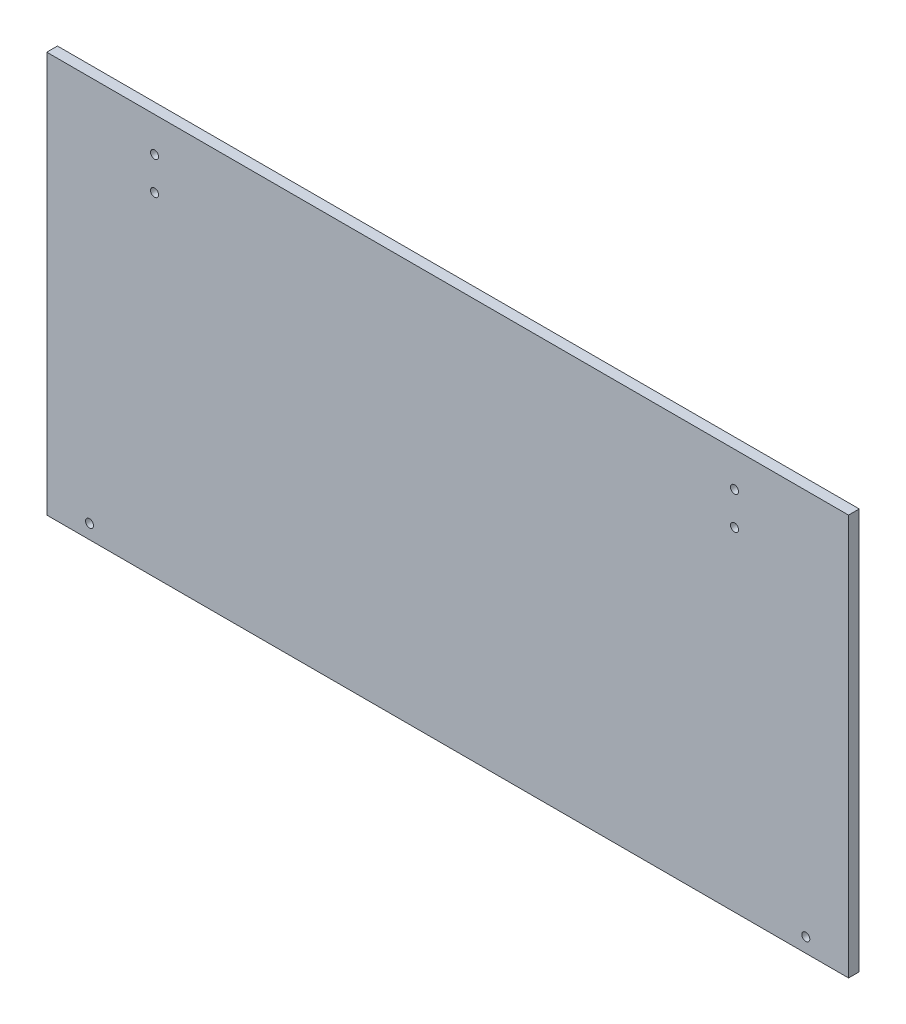
ISO-10303-21;
HEADER;
FILE_DESCRIPTION(('STEP AP214'),'2;1');
FILE_NAME('part.step','',(''),(''),'','','');
FILE_SCHEMA(('AUTOMOTIVE_DESIGN { 1 0 10303 214 1 1 1 1 }'));
ENDSEC;
DATA;
#1=APPLICATION_CONTEXT('core data for automotive mechanical design processes');
#2=APPLICATION_PROTOCOL_DEFINITION('international standard','automotive_design',2000,#1);
#3=PRODUCT_CONTEXT('',#1,'mechanical');
#4=PRODUCT('Part','Part','',(#3));
#5=PRODUCT_RELATED_PRODUCT_CATEGORY('part','',(#4));
#6=PRODUCT_DEFINITION_FORMATION('','',#4);
#7=PRODUCT_DEFINITION_CONTEXT('part definition',#1,'design');
#8=PRODUCT_DEFINITION('design','',#6,#7);
#9=PRODUCT_DEFINITION_SHAPE('','',#8);
#10=(LENGTH_UNIT() NAMED_UNIT(*) SI_UNIT(.MILLI.,.METRE.));
#11=(NAMED_UNIT(*) PLANE_ANGLE_UNIT() SI_UNIT($,.RADIAN.));
#12=(NAMED_UNIT(*) SI_UNIT($,.STERADIAN.) SOLID_ANGLE_UNIT());
#13=UNCERTAINTY_MEASURE_WITH_UNIT(LENGTH_MEASURE(1.E-05),#10,'distance_accuracy_value','');
#14=(GEOMETRIC_REPRESENTATION_CONTEXT(3) GLOBAL_UNCERTAINTY_ASSIGNED_CONTEXT((#13)) GLOBAL_UNIT_ASSIGNED_CONTEXT((#10,
#11,#12)) REPRESENTATION_CONTEXT('',''));
#15=CARTESIAN_POINT('',(0.,0.,0.));
#16=DIRECTION('',(0.,0.,1.));
#17=DIRECTION('',(1.,0.,0.));
#18=AXIS2_PLACEMENT_3D('',#15,#16,#17);
#19=CARTESIAN_POINT('',(-225.,112.5,6.));
#20=DIRECTION('',(1.,0.,0.));
#21=DIRECTION('',(0.,1.,0.));
#22=AXIS2_PLACEMENT_3D('',#19,#20,#21);
#23=PLANE('',#22);
#24=DIRECTION('',(0.,-1.,0.));
#25=VECTOR('',#24,1.);
#26=CARTESIAN_POINT('',(-225.,112.5,0.));
#27=LINE('',#26,#25);
#28=CARTESIAN_POINT('',(-225.,112.5,0.));
#29=VERTEX_POINT('',#28);
#30=CARTESIAN_POINT('',(-225.,-112.5,0.));
#31=VERTEX_POINT('',#30);
#32=EDGE_CURVE('E103',#29,#31,#27,.T.);
#33=ORIENTED_EDGE('',*,*,#32,.T.);
#34=DIRECTION('',(0.,0.,-1.));
#35=VECTOR('',#34,1.);
#36=CARTESIAN_POINT('',(-225.,-112.5,6.));
#37=LINE('',#36,#35);
#38=CARTESIAN_POINT('',(-225.,-112.5,6.));
#39=VERTEX_POINT('',#38);
#40=EDGE_CURVE('E11',#39,#31,#37,.T.);
#41=ORIENTED_EDGE('',*,*,#40,.F.);
#42=DIRECTION('',(0.,-1.,0.));
#43=VECTOR('',#42,1.);
#44=CARTESIAN_POINT('',(-225.,112.5,6.));
#45=LINE('',#44,#43);
#46=CARTESIAN_POINT('',(-225.,112.5,6.));
#47=VERTEX_POINT('',#46);
#48=EDGE_CURVE('E90',#47,#39,#45,.T.);
#49=ORIENTED_EDGE('',*,*,#48,.F.);
#50=DIRECTION('',(0.,0.,-1.));
#51=VECTOR('',#50,1.);
#52=CARTESIAN_POINT('',(-225.,112.5,6.));
#53=LINE('',#52,#51);
#54=EDGE_CURVE('E99',#47,#29,#53,.T.);
#55=ORIENTED_EDGE('',*,*,#54,.T.);
#56=EDGE_LOOP('',(#33,#41,#49,#55));
#57=FACE_BOUND('',#56,.T.);
#58=ADVANCED_FACE('F37',(#57),#23,.F.);
#59=CARTESIAN_POINT('',(-225.,-112.5,6.));
#60=DIRECTION('',(0.,1.,0.));
#61=DIRECTION('',(0.,0.,1.));
#62=AXIS2_PLACEMENT_3D('',#59,#60,#61);
#63=PLANE('',#62);
#64=DIRECTION('',(1.,0.,0.));
#65=VECTOR('',#64,1.);
#66=CARTESIAN_POINT('',(-225.,-112.5,0.));
#67=LINE('',#66,#65);
#68=CARTESIAN_POINT('',(225.,-112.5,0.));
#69=VERTEX_POINT('',#68);
#70=EDGE_CURVE('E94',#31,#69,#67,.T.);
#71=ORIENTED_EDGE('',*,*,#70,.T.);
#72=DIRECTION('',(0.,0.,-1.));
#73=VECTOR('',#72,1.);
#74=CARTESIAN_POINT('',(225.,-112.5,6.));
#75=LINE('',#74,#73);
#76=CARTESIAN_POINT('',(225.,-112.5,6.));
#77=VERTEX_POINT('',#76);
#78=EDGE_CURVE('E46',#77,#69,#75,.T.);
#79=ORIENTED_EDGE('',*,*,#78,.F.);
#80=DIRECTION('',(1.,0.,0.));
#81=VECTOR('',#80,1.);
#82=CARTESIAN_POINT('',(-225.,-112.5,6.));
#83=LINE('',#82,#81);
#84=EDGE_CURVE('E85',#39,#77,#83,.T.);
#85=ORIENTED_EDGE('',*,*,#84,.F.);
#86=ORIENTED_EDGE('',*,*,#40,.T.);
#87=EDGE_LOOP('',(#71,#79,#85,#86));
#88=FACE_BOUND('',#87,.T.);
#89=ADVANCED_FACE('F93',(#88),#63,.F.);
#90=CARTESIAN_POINT('',(225.,112.5,6.));
#91=DIRECTION('',(-1.,0.,0.));
#92=DIRECTION('',(0.,-1.,0.));
#93=AXIS2_PLACEMENT_3D('',#90,#91,#92);
#94=PLANE('',#93);
#95=DIRECTION('',(0.,1.,0.));
#96=VECTOR('',#95,1.);
#97=CARTESIAN_POINT('',(225.,112.5,0.));
#98=LINE('',#97,#96);
#99=CARTESIAN_POINT('',(225.,112.5,0.));
#100=VERTEX_POINT('',#99);
#101=EDGE_CURVE('E72',#69,#100,#98,.T.);
#102=ORIENTED_EDGE('',*,*,#101,.T.);
#103=DIRECTION('',(0.,0.,-1.));
#104=VECTOR('',#103,1.);
#105=CARTESIAN_POINT('',(225.,112.5,6.));
#106=LINE('',#105,#104);
#107=CARTESIAN_POINT('',(225.,112.5,6.));
#108=VERTEX_POINT('',#107);
#109=EDGE_CURVE('E95',#108,#100,#106,.T.);
#110=ORIENTED_EDGE('',*,*,#109,.F.);
#111=DIRECTION('',(0.,1.,0.));
#112=VECTOR('',#111,1.);
#113=CARTESIAN_POINT('',(225.,112.5,6.));
#114=LINE('',#113,#112);
#115=EDGE_CURVE('E88',#77,#108,#114,.T.);
#116=ORIENTED_EDGE('',*,*,#115,.F.);
#117=ORIENTED_EDGE('',*,*,#78,.T.);
#118=EDGE_LOOP('',(#102,#110,#116,#117));
#119=FACE_BOUND('',#118,.T.);
#120=ADVANCED_FACE('F97',(#119),#94,.F.);
#121=CARTESIAN_POINT('',(-225.,112.5,6.));
#122=DIRECTION('',(0.,-1.,0.));
#123=DIRECTION('',(0.,0.,-1.));
#124=AXIS2_PLACEMENT_3D('',#121,#122,#123);
#125=PLANE('',#124);
#126=DIRECTION('',(-1.,0.,0.));
#127=VECTOR('',#126,1.);
#128=CARTESIAN_POINT('',(-225.,112.5,0.));
#129=LINE('',#128,#127);
#130=EDGE_CURVE('E78',#100,#29,#129,.T.);
#131=ORIENTED_EDGE('',*,*,#130,.T.);
#132=ORIENTED_EDGE('',*,*,#54,.F.);
#133=DIRECTION('',(-1.,0.,0.));
#134=VECTOR('',#133,1.);
#135=CARTESIAN_POINT('',(-225.,112.5,6.));
#136=LINE('',#135,#134);
#137=EDGE_CURVE('E55',#108,#47,#136,.T.);
#138=ORIENTED_EDGE('',*,*,#137,.F.);
#139=ORIENTED_EDGE('',*,*,#109,.T.);
#140=EDGE_LOOP('',(#131,#132,#138,#139));
#141=FACE_BOUND('',#140,.T.);
#142=ADVANCED_FACE('F154',(#141),#125,.F.);
#143=CARTESIAN_POINT('',(0.,0.,6.));
#144=DIRECTION('',(0.,0.,1.));
#145=DIRECTION('',(1.,0.,0.));
#146=AXIS2_PLACEMENT_3D('',#143,#144,#145);
#147=PLANE('',#146);
#148=CARTESIAN_POINT('',(-201.,-104.5,6.));
#149=DIRECTION('',(0.,0.,1.));
#150=DIRECTION('',(1.,0.,0.));
#151=AXIS2_PLACEMENT_3D('',#148,#149,#150);
#152=CIRCLE('',#151,2.25000000000001);
#153=CARTESIAN_POINT('',(-198.75,-104.5,6.));
#154=VERTEX_POINT('',#153);
#155=EDGE_CURVE('E125',#154,#154,#152,.T.);
#156=ORIENTED_EDGE('',*,*,#155,.F.);
#157=EDGE_LOOP('',(#156));
#158=FACE_BOUND('',#157,.T.);
#159=CARTESIAN_POINT('',(201.,-104.5,6.));
#160=DIRECTION('',(0.,0.,1.));
#161=DIRECTION('',(1.,0.,0.));
#162=AXIS2_PLACEMENT_3D('',#159,#160,#161);
#163=CIRCLE('',#162,2.25000000000001);
#164=CARTESIAN_POINT('',(203.25,-104.5,6.));
#165=VERTEX_POINT('',#164);
#166=EDGE_CURVE('E131',#165,#165,#163,.T.);
#167=ORIENTED_EDGE('',*,*,#166,.F.);
#168=EDGE_LOOP('',(#167));
#169=FACE_BOUND('',#168,.T.);
#170=CARTESIAN_POINT('',(-164.5,74.4999999999998,6.));
#171=DIRECTION('',(0.,0.,1.));
#172=DIRECTION('',(1.,0.,0.));
#173=AXIS2_PLACEMENT_3D('',#170,#171,#172);
#174=CIRCLE('',#173,2.25000000000001);
#175=CARTESIAN_POINT('',(-162.25,74.4999999999998,6.));
#176=VERTEX_POINT('',#175);
#177=EDGE_CURVE('E141',#176,#176,#174,.T.);
#178=ORIENTED_EDGE('',*,*,#177,.F.);
#179=EDGE_LOOP('',(#178));
#180=FACE_BOUND('',#179,.T.);
#181=CARTESIAN_POINT('',(161.,92.9999999999999,6.));
#182=DIRECTION('',(0.,0.,1.));
#183=DIRECTION('',(1.,0.,0.));
#184=AXIS2_PLACEMENT_3D('',#181,#182,#183);
#185=CIRCLE('',#184,2.25000000000001);
#186=CARTESIAN_POINT('',(163.25,92.9999999999999,6.));
#187=VERTEX_POINT('',#186);
#188=EDGE_CURVE('E140',#187,#187,#185,.T.);
#189=ORIENTED_EDGE('',*,*,#188,.F.);
#190=EDGE_LOOP('',(#189));
#191=FACE_BOUND('',#190,.T.);
#192=CARTESIAN_POINT('',(161.,74.4999999999999,6.));
#193=DIRECTION('',(0.,0.,1.));
#194=DIRECTION('',(1.,0.,0.));
#195=AXIS2_PLACEMENT_3D('',#192,#193,#194);
#196=CIRCLE('',#195,2.25000000000001);
#197=CARTESIAN_POINT('',(163.25,74.4999999999999,6.));
#198=VERTEX_POINT('',#197);
#199=EDGE_CURVE('E129',#198,#198,#196,.T.);
#200=ORIENTED_EDGE('',*,*,#199,.F.);
#201=EDGE_LOOP('',(#200));
#202=FACE_BOUND('',#201,.T.);
#203=CARTESIAN_POINT('',(-164.5,92.9999999999998,6.));
#204=DIRECTION('',(0.,0.,1.));
#205=DIRECTION('',(1.,0.,0.));
#206=AXIS2_PLACEMENT_3D('',#203,#204,#205);
#207=CIRCLE('',#206,2.25000000000001);
#208=CARTESIAN_POINT('',(-162.25,92.9999999999998,6.));
#209=VERTEX_POINT('',#208);
#210=EDGE_CURVE('E116',#209,#209,#207,.T.);
#211=ORIENTED_EDGE('',*,*,#210,.F.);
#212=EDGE_LOOP('',(#211));
#213=FACE_BOUND('',#212,.T.);
#214=ORIENTED_EDGE('',*,*,#48,.T.);
#215=ORIENTED_EDGE('',*,*,#84,.T.);
#216=ORIENTED_EDGE('',*,*,#115,.T.);
#217=ORIENTED_EDGE('',*,*,#137,.T.);
#218=EDGE_LOOP('',(#214,#215,#216,#217));
#219=FACE_BOUND('',#218,.T.);
#220=ADVANCED_FACE('F86',(#158,#169,#180,#191,#202,#213,#219),#147,.T.);
#221=CARTESIAN_POINT('',(0.,0.,0.));
#222=DIRECTION('',(0.,0.,1.));
#223=DIRECTION('',(1.,0.,0.));
#224=AXIS2_PLACEMENT_3D('',#221,#222,#223);
#225=PLANE('',#224);
#226=CARTESIAN_POINT('',(-201.,-104.5,0.));
#227=DIRECTION('',(0.,0.,1.));
#228=DIRECTION('',(1.,0.,0.));
#229=AXIS2_PLACEMENT_3D('',#226,#227,#228);
#230=CIRCLE('',#229,2.25000000000001);
#231=CARTESIAN_POINT('',(-198.75,-104.5,0.));
#232=VERTEX_POINT('',#231);
#233=EDGE_CURVE('E40',#232,#232,#230,.T.);
#234=ORIENTED_EDGE('',*,*,#233,.T.);
#235=EDGE_LOOP('',(#234));
#236=FACE_BOUND('',#235,.T.);
#237=CARTESIAN_POINT('',(201.,-104.5,0.));
#238=DIRECTION('',(0.,0.,1.));
#239=DIRECTION('',(1.,0.,0.));
#240=AXIS2_PLACEMENT_3D('',#237,#238,#239);
#241=CIRCLE('',#240,2.25000000000001);
#242=CARTESIAN_POINT('',(203.25,-104.5,0.));
#243=VERTEX_POINT('',#242);
#244=EDGE_CURVE('E123',#243,#243,#241,.T.);
#245=ORIENTED_EDGE('',*,*,#244,.T.);
#246=EDGE_LOOP('',(#245));
#247=FACE_BOUND('',#246,.T.);
#248=CARTESIAN_POINT('',(-164.5,74.4999999999998,0.));
#249=DIRECTION('',(0.,0.,1.));
#250=DIRECTION('',(1.,0.,0.));
#251=AXIS2_PLACEMENT_3D('',#248,#249,#250);
#252=CIRCLE('',#251,2.25000000000001);
#253=CARTESIAN_POINT('',(-162.25,74.4999999999998,0.));
#254=VERTEX_POINT('',#253);
#255=EDGE_CURVE('E106',#254,#254,#252,.T.);
#256=ORIENTED_EDGE('',*,*,#255,.T.);
#257=EDGE_LOOP('',(#256));
#258=FACE_BOUND('',#257,.T.);
#259=CARTESIAN_POINT('',(161.,92.9999999999999,0.));
#260=DIRECTION('',(0.,0.,1.));
#261=DIRECTION('',(1.,0.,0.));
#262=AXIS2_PLACEMENT_3D('',#259,#260,#261);
#263=CIRCLE('',#262,2.25000000000001);
#264=CARTESIAN_POINT('',(163.25,92.9999999999999,0.));
#265=VERTEX_POINT('',#264);
#266=EDGE_CURVE('E119',#265,#265,#263,.T.);
#267=ORIENTED_EDGE('',*,*,#266,.T.);
#268=EDGE_LOOP('',(#267));
#269=FACE_BOUND('',#268,.T.);
#270=CARTESIAN_POINT('',(161.,74.4999999999999,0.));
#271=DIRECTION('',(0.,0.,1.));
#272=DIRECTION('',(1.,0.,0.));
#273=AXIS2_PLACEMENT_3D('',#270,#271,#272);
#274=CIRCLE('',#273,2.25000000000001);
#275=CARTESIAN_POINT('',(163.25,74.4999999999999,0.));
#276=VERTEX_POINT('',#275);
#277=EDGE_CURVE('E115',#276,#276,#274,.T.);
#278=ORIENTED_EDGE('',*,*,#277,.T.);
#279=EDGE_LOOP('',(#278));
#280=FACE_BOUND('',#279,.T.);
#281=CARTESIAN_POINT('',(-164.5,92.9999999999998,0.));
#282=DIRECTION('',(0.,0.,1.));
#283=DIRECTION('',(1.,0.,0.));
#284=AXIS2_PLACEMENT_3D('',#281,#282,#283);
#285=CIRCLE('',#284,2.25000000000001);
#286=CARTESIAN_POINT('',(-162.25,92.9999999999998,0.));
#287=VERTEX_POINT('',#286);
#288=EDGE_CURVE('E112',#287,#287,#285,.T.);
#289=ORIENTED_EDGE('',*,*,#288,.T.);
#290=EDGE_LOOP('',(#289));
#291=FACE_BOUND('',#290,.T.);
#292=ORIENTED_EDGE('',*,*,#32,.F.);
#293=ORIENTED_EDGE('',*,*,#130,.F.);
#294=ORIENTED_EDGE('',*,*,#101,.F.);
#295=ORIENTED_EDGE('',*,*,#70,.F.);
#296=EDGE_LOOP('',(#292,#293,#294,#295));
#297=FACE_BOUND('',#296,.T.);
#298=ADVANCED_FACE('F153',(#236,#247,#258,#269,#280,#291,#297),#225,.F.);
#299=CARTESIAN_POINT('',(-164.5,92.9999999999998,-4.));
#300=DIRECTION('',(0.,0.,1.));
#301=DIRECTION('',(1.,0.,0.));
#302=AXIS2_PLACEMENT_3D('',#299,#300,#301);
#303=CYLINDRICAL_SURFACE('',#302,2.25000000000001);
#304=ORIENTED_EDGE('',*,*,#210,.T.);
#305=EDGE_LOOP('',(#304));
#306=FACE_BOUND('',#305,.T.);
#307=ORIENTED_EDGE('',*,*,#288,.F.);
#308=EDGE_LOOP('',(#307));
#309=FACE_BOUND('',#308,.T.);
#310=ADVANCED_FACE('F149',(#306,#309),#303,.F.);
#311=CARTESIAN_POINT('',(161.,74.4999999999999,-4.));
#312=DIRECTION('',(0.,0.,1.));
#313=DIRECTION('',(1.,0.,0.));
#314=AXIS2_PLACEMENT_3D('',#311,#312,#313);
#315=CYLINDRICAL_SURFACE('',#314,2.25000000000001);
#316=ORIENTED_EDGE('',*,*,#199,.T.);
#317=EDGE_LOOP('',(#316));
#318=FACE_BOUND('',#317,.T.);
#319=ORIENTED_EDGE('',*,*,#277,.F.);
#320=EDGE_LOOP('',(#319));
#321=FACE_BOUND('',#320,.T.);
#322=ADVANCED_FACE('F204',(#318,#321),#315,.F.);
#323=CARTESIAN_POINT('',(161.,92.9999999999999,-4.));
#324=DIRECTION('',(0.,0.,1.));
#325=DIRECTION('',(1.,0.,0.));
#326=AXIS2_PLACEMENT_3D('',#323,#324,#325);
#327=CYLINDRICAL_SURFACE('',#326,2.25000000000001);
#328=ORIENTED_EDGE('',*,*,#188,.T.);
#329=EDGE_LOOP('',(#328));
#330=FACE_BOUND('',#329,.T.);
#331=ORIENTED_EDGE('',*,*,#266,.F.);
#332=EDGE_LOOP('',(#331));
#333=FACE_BOUND('',#332,.T.);
#334=ADVANCED_FACE('F209',(#330,#333),#327,.F.);
#335=CARTESIAN_POINT('',(-164.5,74.4999999999998,-4.));
#336=DIRECTION('',(0.,0.,1.));
#337=DIRECTION('',(1.,0.,0.));
#338=AXIS2_PLACEMENT_3D('',#335,#336,#337);
#339=CYLINDRICAL_SURFACE('',#338,2.25000000000001);
#340=ORIENTED_EDGE('',*,*,#177,.T.);
#341=EDGE_LOOP('',(#340));
#342=FACE_BOUND('',#341,.T.);
#343=ORIENTED_EDGE('',*,*,#255,.F.);
#344=EDGE_LOOP('',(#343));
#345=FACE_BOUND('',#344,.T.);
#346=ADVANCED_FACE('F217',(#342,#345),#339,.F.);
#347=CARTESIAN_POINT('',(201.,-104.5,-4.));
#348=DIRECTION('',(0.,0.,1.));
#349=DIRECTION('',(1.,0.,0.));
#350=AXIS2_PLACEMENT_3D('',#347,#348,#349);
#351=CYLINDRICAL_SURFACE('',#350,2.25000000000001);
#352=ORIENTED_EDGE('',*,*,#166,.T.);
#353=EDGE_LOOP('',(#352));
#354=FACE_BOUND('',#353,.T.);
#355=ORIENTED_EDGE('',*,*,#244,.F.);
#356=EDGE_LOOP('',(#355));
#357=FACE_BOUND('',#356,.T.);
#358=ADVANCED_FACE('F224',(#354,#357),#351,.F.);
#359=CARTESIAN_POINT('',(-201.,-104.5,-4.));
#360=DIRECTION('',(0.,0.,1.));
#361=DIRECTION('',(1.,0.,0.));
#362=AXIS2_PLACEMENT_3D('',#359,#360,#361);
#363=CYLINDRICAL_SURFACE('',#362,2.25000000000001);
#364=ORIENTED_EDGE('',*,*,#155,.T.);
#365=EDGE_LOOP('',(#364));
#366=FACE_BOUND('',#365,.T.);
#367=ORIENTED_EDGE('',*,*,#233,.F.);
#368=EDGE_LOOP('',(#367));
#369=FACE_BOUND('',#368,.T.);
#370=ADVANCED_FACE('F231',(#366,#369),#363,.F.);
#371=CLOSED_SHELL('',(#58,#89,#120,#142,#220,#298,#310,#322,#334,#346,#358,#370));
#372=MANIFOLD_SOLID_BREP('B2',#371);
#373=ADVANCED_BREP_SHAPE_REPRESENTATION('',(#18,#372),#14);
#374=SHAPE_DEFINITION_REPRESENTATION(#9,#373);
ENDSEC;
END-ISO-10303-21;
